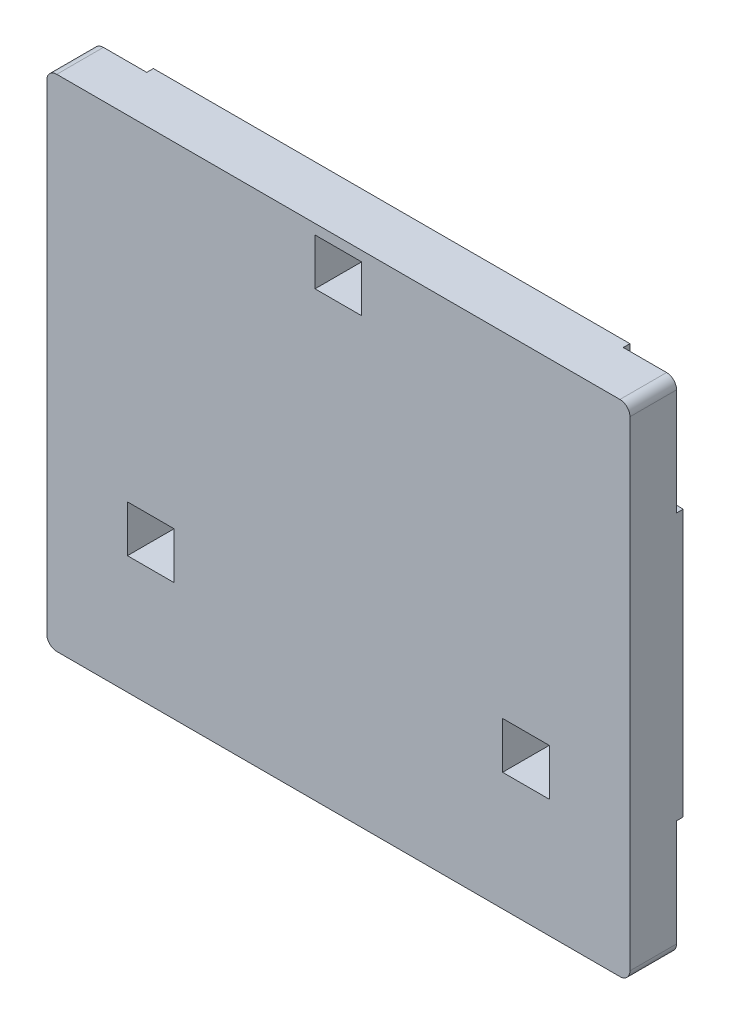
ISO-10303-21;
HEADER;
FILE_DESCRIPTION(('STEP AP214'),'2;1');
FILE_NAME('part.step','',(''),(''),'','','');
FILE_SCHEMA(('AUTOMOTIVE_DESIGN { 1 0 10303 214 1 1 1 1 }'));
ENDSEC;
DATA;
#1=APPLICATION_CONTEXT('core data for automotive mechanical design processes');
#2=APPLICATION_PROTOCOL_DEFINITION('international standard','automotive_design',2000,#1);
#3=PRODUCT_CONTEXT('',#1,'mechanical');
#4=PRODUCT('Part','Part','',(#3));
#5=PRODUCT_RELATED_PRODUCT_CATEGORY('part','',(#4));
#6=PRODUCT_DEFINITION_FORMATION('','',#4);
#7=PRODUCT_DEFINITION_CONTEXT('part definition',#1,'design');
#8=PRODUCT_DEFINITION('design','',#6,#7);
#9=PRODUCT_DEFINITION_SHAPE('','',#8);
#10=(LENGTH_UNIT() NAMED_UNIT(*) SI_UNIT(.MILLI.,.METRE.));
#11=(NAMED_UNIT(*) PLANE_ANGLE_UNIT() SI_UNIT($,.RADIAN.));
#12=(NAMED_UNIT(*) SI_UNIT($,.STERADIAN.) SOLID_ANGLE_UNIT());
#13=UNCERTAINTY_MEASURE_WITH_UNIT(LENGTH_MEASURE(1.E-05),#10,'distance_accuracy_value','');
#14=(GEOMETRIC_REPRESENTATION_CONTEXT(3) GLOBAL_UNCERTAINTY_ASSIGNED_CONTEXT((#13)) GLOBAL_UNIT_ASSIGNED_CONTEXT((#10,
#11,#12)) REPRESENTATION_CONTEXT('',''));
#15=CARTESIAN_POINT('',(0.,0.,0.));
#16=DIRECTION('',(0.,0.,1.));
#17=DIRECTION('',(1.,0.,0.));
#18=AXIS2_PLACEMENT_3D('',#15,#16,#17);
#19=CARTESIAN_POINT('',(0.,0.,16.));
#20=DIRECTION('',(-1.,0.,0.));
#21=DIRECTION('',(0.,-1.,0.));
#22=AXIS2_PLACEMENT_3D('',#19,#20,#21);
#23=PLANE('',#22);
#24=DIRECTION('',(0.,-1.,0.));
#25=VECTOR('',#24,1.);
#26=CARTESIAN_POINT('',(0.,0.,2.));
#27=LINE('',#26,#25);
#28=CARTESIAN_POINT('',(0.,-3.,2.));
#29=VERTEX_POINT('',#28);
#30=CARTESIAN_POINT('',(0.,-35.,2.));
#31=VERTEX_POINT('',#30);
#32=EDGE_CURVE('E299',#29,#31,#27,.T.);
#33=ORIENTED_EDGE('',*,*,#32,.F.);
#34=DIRECTION('',(0.,0.,-1.));
#35=VECTOR('',#34,1.);
#36=CARTESIAN_POINT('',(0.,-3.,16.));
#37=LINE('',#36,#35);
#38=CARTESIAN_POINT('',(0.,-3.,16.));
#39=VERTEX_POINT('',#38);
#40=EDGE_CURVE('E471',#29,#39,#37,.F.);
#41=ORIENTED_EDGE('',*,*,#40,.T.);
#42=DIRECTION('',(0.,1.,0.));
#43=VECTOR('',#42,1.);
#44=CARTESIAN_POINT('',(0.,0.,16.));
#45=LINE('',#44,#43);
#46=CARTESIAN_POINT('',(0.,-147.,16.));
#47=VERTEX_POINT('',#46);
#48=EDGE_CURVE('E440',#47,#39,#45,.T.);
#49=ORIENTED_EDGE('',*,*,#48,.F.);
#50=DIRECTION('',(0.,0.,-1.));
#51=VECTOR('',#50,1.);
#52=CARTESIAN_POINT('',(0.,-147.,16.));
#53=LINE('',#52,#51);
#54=CARTESIAN_POINT('',(0.,-147.,2.));
#55=VERTEX_POINT('',#54);
#56=EDGE_CURVE('E468',#47,#55,#53,.T.);
#57=ORIENTED_EDGE('',*,*,#56,.T.);
#58=DIRECTION('',(0.,-1.,0.));
#59=VECTOR('',#58,1.);
#60=CARTESIAN_POINT('',(0.,-150.,2.));
#61=LINE('',#60,#59);
#62=CARTESIAN_POINT('',(0.,-115.,2.));
#63=VERTEX_POINT('',#62);
#64=EDGE_CURVE('E274',#63,#55,#61,.T.);
#65=ORIENTED_EDGE('',*,*,#64,.F.);
#66=DIRECTION('',(0.,0.,-1.));
#67=VECTOR('',#66,1.);
#68=CARTESIAN_POINT('',(0.,-115.,2.));
#69=LINE('',#68,#67);
#70=CARTESIAN_POINT('',(0.,-115.,0.));
#71=VERTEX_POINT('',#70);
#72=EDGE_CURVE('E292',#63,#71,#69,.T.);
#73=ORIENTED_EDGE('',*,*,#72,.T.);
#74=DIRECTION('',(0.,1.,0.));
#75=VECTOR('',#74,1.);
#76=CARTESIAN_POINT('',(0.,0.,0.));
#77=LINE('',#76,#75);
#78=CARTESIAN_POINT('',(0.,-35.,0.));
#79=VERTEX_POINT('',#78);
#80=EDGE_CURVE('E371',#71,#79,#77,.T.);
#81=ORIENTED_EDGE('',*,*,#80,.T.);
#82=DIRECTION('',(0.,0.,-1.));
#83=VECTOR('',#82,1.);
#84=CARTESIAN_POINT('',(0.,-35.,2.));
#85=LINE('',#84,#83);
#86=EDGE_CURVE('E311',#31,#79,#85,.T.);
#87=ORIENTED_EDGE('',*,*,#86,.F.);
#88=EDGE_LOOP('',(#33,#41,#49,#57,#65,#73,#81,#87));
#89=FACE_BOUND('',#88,.T.);
#90=ADVANCED_FACE('F37',(#89),#23,.F.);
#91=CARTESIAN_POINT('',(0.,0.,16.));
#92=DIRECTION('',(0.,-1.,0.));
#93=DIRECTION('',(1.,0.,0.));
#94=AXIS2_PLACEMENT_3D('',#91,#92,#93);
#95=PLANE('',#94);
#96=DIRECTION('',(-1.,0.,0.));
#97=VECTOR('',#96,1.);
#98=CARTESIAN_POINT('',(0.,0.,16.));
#99=LINE('',#98,#97);
#100=CARTESIAN_POINT('',(-3.,0.,16.));
#101=VERTEX_POINT('',#100);
#102=CARTESIAN_POINT('',(-172.,0.,16.));
#103=VERTEX_POINT('',#102);
#104=EDGE_CURVE('E443',#101,#103,#99,.T.);
#105=ORIENTED_EDGE('',*,*,#104,.F.);
#106=DIRECTION('',(0.,0.,-1.));
#107=VECTOR('',#106,1.);
#108=CARTESIAN_POINT('',(-3.,0.,16.));
#109=LINE('',#108,#107);
#110=CARTESIAN_POINT('',(-3.,0.,2.));
#111=VERTEX_POINT('',#110);
#112=EDGE_CURVE('E463',#101,#111,#109,.T.);
#113=ORIENTED_EDGE('',*,*,#112,.T.);
#114=DIRECTION('',(1.,0.,0.));
#115=VECTOR('',#114,1.);
#116=CARTESIAN_POINT('',(0.,0.,2.));
#117=LINE('',#116,#115);
#118=CARTESIAN_POINT('',(-16.,0.,2.));
#119=VERTEX_POINT('',#118);
#120=EDGE_CURVE('E308',#119,#111,#117,.T.);
#121=ORIENTED_EDGE('',*,*,#120,.F.);
#122=DIRECTION('',(0.,0.,-1.));
#123=VECTOR('',#122,1.);
#124=CARTESIAN_POINT('',(-16.,0.,2.));
#125=LINE('',#124,#123);
#126=CARTESIAN_POINT('',(-16.,0.,0.));
#127=VERTEX_POINT('',#126);
#128=EDGE_CURVE('E290',#119,#127,#125,.T.);
#129=ORIENTED_EDGE('',*,*,#128,.T.);
#130=DIRECTION('',(-1.,0.,0.));
#131=VECTOR('',#130,1.);
#132=CARTESIAN_POINT('',(0.,0.,0.));
#133=LINE('',#132,#131);
#134=CARTESIAN_POINT('',(-159.,0.,0.));
#135=VERTEX_POINT('',#134);
#136=EDGE_CURVE('E456',#127,#135,#133,.T.);
#137=ORIENTED_EDGE('',*,*,#136,.T.);
#138=DIRECTION('',(0.,0.,-1.));
#139=VECTOR('',#138,1.);
#140=CARTESIAN_POINT('',(-159.,0.,2.));
#141=LINE('',#140,#139);
#142=CARTESIAN_POINT('',(-159.,0.,2.));
#143=VERTEX_POINT('',#142);
#144=EDGE_CURVE('E333',#143,#135,#141,.T.);
#145=ORIENTED_EDGE('',*,*,#144,.F.);
#146=DIRECTION('',(1.,0.,0.));
#147=VECTOR('',#146,1.);
#148=CARTESIAN_POINT('',(-175.,0.,2.));
#149=LINE('',#148,#147);
#150=CARTESIAN_POINT('',(-172.,0.,2.));
#151=VERTEX_POINT('',#150);
#152=EDGE_CURVE('E324',#151,#143,#149,.T.);
#153=ORIENTED_EDGE('',*,*,#152,.F.);
#154=DIRECTION('',(0.,0.,-1.));
#155=VECTOR('',#154,1.);
#156=CARTESIAN_POINT('',(-172.,0.,16.));
#157=LINE('',#156,#155);
#158=EDGE_CURVE('E453',#151,#103,#157,.F.);
#159=ORIENTED_EDGE('',*,*,#158,.T.);
#160=EDGE_LOOP('',(#105,#113,#121,#129,#137,#145,#153,#159));
#161=FACE_BOUND('',#160,.T.);
#162=ADVANCED_FACE('F538',(#161),#95,.F.);
#163=CARTESIAN_POINT('',(-175.,0.,16.));
#164=DIRECTION('',(1.,0.,0.));
#165=DIRECTION('',(0.,1.,0.));
#166=AXIS2_PLACEMENT_3D('',#163,#164,#165);
#167=PLANE('',#166);
#168=DIRECTION('',(0.,1.,0.));
#169=VECTOR('',#168,1.);
#170=CARTESIAN_POINT('',(-175.,-150.,2.));
#171=LINE('',#170,#169);
#172=CARTESIAN_POINT('',(-175.,-147.,2.));
#173=VERTEX_POINT('',#172);
#174=CARTESIAN_POINT('',(-175.,-115.,2.));
#175=VERTEX_POINT('',#174);
#176=EDGE_CURVE('E243',#173,#175,#171,.T.);
#177=ORIENTED_EDGE('',*,*,#176,.F.);
#178=DIRECTION('',(0.,0.,-1.));
#179=VECTOR('',#178,1.);
#180=CARTESIAN_POINT('',(-175.,-147.,16.));
#181=LINE('',#180,#179);
#182=CARTESIAN_POINT('',(-175.,-147.,16.));
#183=VERTEX_POINT('',#182);
#184=EDGE_CURVE('E45',#173,#183,#181,.F.);
#185=ORIENTED_EDGE('',*,*,#184,.T.);
#186=DIRECTION('',(0.,-1.,0.));
#187=VECTOR('',#186,1.);
#188=CARTESIAN_POINT('',(-175.,0.,16.));
#189=LINE('',#188,#187);
#190=CARTESIAN_POINT('',(-175.,-3.00000000000002,16.));
#191=VERTEX_POINT('',#190);
#192=EDGE_CURVE('E447',#191,#183,#189,.T.);
#193=ORIENTED_EDGE('',*,*,#192,.F.);
#194=DIRECTION('',(0.,0.,-1.));
#195=VECTOR('',#194,1.);
#196=CARTESIAN_POINT('',(-175.,-3.00000000000002,16.));
#197=LINE('',#196,#195);
#198=CARTESIAN_POINT('',(-175.,-3.00000000000002,2.));
#199=VERTEX_POINT('',#198);
#200=EDGE_CURVE('E489',#191,#199,#197,.T.);
#201=ORIENTED_EDGE('',*,*,#200,.T.);
#202=DIRECTION('',(0.,1.,0.));
#203=VECTOR('',#202,1.);
#204=CARTESIAN_POINT('',(-175.,0.,2.));
#205=LINE('',#204,#203);
#206=CARTESIAN_POINT('',(-175.,-34.9999999999999,2.));
#207=VERTEX_POINT('',#206);
#208=EDGE_CURVE('E321',#207,#199,#205,.T.);
#209=ORIENTED_EDGE('',*,*,#208,.F.);
#210=DIRECTION('',(0.,0.,-1.));
#211=VECTOR('',#210,1.);
#212=CARTESIAN_POINT('',(-175.,-34.9999999999999,2.));
#213=LINE('',#212,#211);
#214=CARTESIAN_POINT('',(-175.,-34.9999999999999,0.));
#215=VERTEX_POINT('',#214);
#216=EDGE_CURVE('E338',#207,#215,#213,.T.);
#217=ORIENTED_EDGE('',*,*,#216,.T.);
#218=DIRECTION('',(0.,-1.,0.));
#219=VECTOR('',#218,1.);
#220=CARTESIAN_POINT('',(-175.,0.,0.));
#221=LINE('',#220,#219);
#222=CARTESIAN_POINT('',(-175.,-115.,0.));
#223=VERTEX_POINT('',#222);
#224=EDGE_CURVE('E266',#215,#223,#221,.T.);
#225=ORIENTED_EDGE('',*,*,#224,.T.);
#226=DIRECTION('',(0.,0.,-1.));
#227=VECTOR('',#226,1.);
#228=CARTESIAN_POINT('',(-175.,-115.,2.));
#229=LINE('',#228,#227);
#230=EDGE_CURVE('E256',#175,#223,#229,.T.);
#231=ORIENTED_EDGE('',*,*,#230,.F.);
#232=EDGE_LOOP('',(#177,#185,#193,#201,#209,#217,#225,#231));
#233=FACE_BOUND('',#232,.T.);
#234=ADVANCED_FACE('F263',(#233),#167,.F.);
#235=CARTESIAN_POINT('',(0.,-150.,16.));
#236=DIRECTION('',(0.,1.,0.));
#237=DIRECTION('',(-1.,0.,0.));
#238=AXIS2_PLACEMENT_3D('',#235,#236,#237);
#239=PLANE('',#238);
#240=DIRECTION('',(-1.,0.,0.));
#241=VECTOR('',#240,1.);
#242=CARTESIAN_POINT('',(0.,-150.,2.));
#243=LINE('',#242,#241);
#244=CARTESIAN_POINT('',(-2.99999999999998,-150.,2.));
#245=VERTEX_POINT('',#244);
#246=CARTESIAN_POINT('',(-16.,-150.,2.));
#247=VERTEX_POINT('',#246);
#248=EDGE_CURVE('E277',#245,#247,#243,.T.);
#249=ORIENTED_EDGE('',*,*,#248,.F.);
#250=DIRECTION('',(0.,0.,-1.));
#251=VECTOR('',#250,1.);
#252=CARTESIAN_POINT('',(-2.99999999999998,-150.,16.));
#253=LINE('',#252,#251);
#254=CARTESIAN_POINT('',(-2.99999999999998,-150.,16.));
#255=VERTEX_POINT('',#254);
#256=EDGE_CURVE('E486',#245,#255,#253,.F.);
#257=ORIENTED_EDGE('',*,*,#256,.T.);
#258=DIRECTION('',(1.,0.,0.));
#259=VECTOR('',#258,1.);
#260=CARTESIAN_POINT('',(0.,-150.,16.));
#261=LINE('',#260,#259);
#262=CARTESIAN_POINT('',(-172.,-150.,16.));
#263=VERTEX_POINT('',#262);
#264=EDGE_CURVE('E450',#263,#255,#261,.T.);
#265=ORIENTED_EDGE('',*,*,#264,.F.);
#266=DIRECTION('',(0.,0.,-1.));
#267=VECTOR('',#266,1.);
#268=CARTESIAN_POINT('',(-172.,-150.,16.));
#269=LINE('',#268,#267);
#270=CARTESIAN_POINT('',(-172.,-150.,2.));
#271=VERTEX_POINT('',#270);
#272=EDGE_CURVE('E483',#263,#271,#269,.T.);
#273=ORIENTED_EDGE('',*,*,#272,.T.);
#274=DIRECTION('',(-1.,0.,0.));
#275=VECTOR('',#274,1.);
#276=CARTESIAN_POINT('',(-175.,-150.,2.));
#277=LINE('',#276,#275);
#278=CARTESIAN_POINT('',(-159.,-150.,2.));
#279=VERTEX_POINT('',#278);
#280=EDGE_CURVE('E267',#279,#271,#277,.T.);
#281=ORIENTED_EDGE('',*,*,#280,.F.);
#282=DIRECTION('',(0.,0.,-1.));
#283=VECTOR('',#282,1.);
#284=CARTESIAN_POINT('',(-159.,-150.,2.));
#285=LINE('',#284,#283);
#286=CARTESIAN_POINT('',(-159.,-150.,0.));
#287=VERTEX_POINT('',#286);
#288=EDGE_CURVE('E269',#279,#287,#285,.T.);
#289=ORIENTED_EDGE('',*,*,#288,.T.);
#290=DIRECTION('',(1.,0.,0.));
#291=VECTOR('',#290,1.);
#292=CARTESIAN_POINT('',(0.,-150.,0.));
#293=LINE('',#292,#291);
#294=CARTESIAN_POINT('',(-16.,-150.,0.));
#295=VERTEX_POINT('',#294);
#296=EDGE_CURVE('E444',#287,#295,#293,.T.);
#297=ORIENTED_EDGE('',*,*,#296,.T.);
#298=DIRECTION('',(0.,0.,-1.));
#299=VECTOR('',#298,1.);
#300=CARTESIAN_POINT('',(-16.,-150.,2.));
#301=LINE('',#300,#299);
#302=EDGE_CURVE('E286',#247,#295,#301,.T.);
#303=ORIENTED_EDGE('',*,*,#302,.F.);
#304=EDGE_LOOP('',(#249,#257,#265,#273,#281,#289,#297,#303));
#305=FACE_BOUND('',#304,.T.);
#306=ADVANCED_FACE('F502',(#305),#239,.F.);
#307=CARTESIAN_POINT('',(0.,0.,16.));
#308=DIRECTION('',(0.,0.,-1.));
#309=DIRECTION('',(-1.,0.,0.));
#310=AXIS2_PLACEMENT_3D('',#307,#308,#309);
#311=PLANE('',#310);
#312=DIRECTION('',(1.,0.,0.));
#313=VECTOR('',#312,1.);
#314=CARTESIAN_POINT('',(-80.5,-17.,16.));
#315=LINE('',#314,#313);
#316=CARTESIAN_POINT('',(-94.5,-17.,16.));
#317=VERTEX_POINT('',#316);
#318=CARTESIAN_POINT('',(-80.5,-17.,16.));
#319=VERTEX_POINT('',#318);
#320=EDGE_CURVE('E360',#317,#319,#315,.T.);
#321=ORIENTED_EDGE('',*,*,#320,.F.);
#322=DIRECTION('',(0.,-1.,0.));
#323=VECTOR('',#322,1.);
#324=CARTESIAN_POINT('',(-94.5,-3.00000000000004,16.));
#325=LINE('',#324,#323);
#326=CARTESIAN_POINT('',(-94.5,-3.00000000000004,16.));
#327=VERTEX_POINT('',#326);
#328=EDGE_CURVE('E358',#327,#317,#325,.T.);
#329=ORIENTED_EDGE('',*,*,#328,.F.);
#330=DIRECTION('',(-1.,0.,0.));
#331=VECTOR('',#330,1.);
#332=CARTESIAN_POINT('',(-80.5,-3.00000000000003,16.));
#333=LINE('',#332,#331);
#334=CARTESIAN_POINT('',(-80.5,-3.00000000000003,16.));
#335=VERTEX_POINT('',#334);
#336=EDGE_CURVE('E348',#335,#327,#333,.T.);
#337=ORIENTED_EDGE('',*,*,#336,.F.);
#338=DIRECTION('',(0.,1.,0.));
#339=VECTOR('',#338,1.);
#340=CARTESIAN_POINT('',(-80.5,-3.00000000000003,16.));
#341=LINE('',#340,#339);
#342=EDGE_CURVE('E364',#319,#335,#341,.T.);
#343=ORIENTED_EDGE('',*,*,#342,.F.);
#344=EDGE_LOOP('',(#321,#329,#337,#343));
#345=FACE_BOUND('',#344,.T.);
#346=DIRECTION('',(1.,0.,0.));
#347=VECTOR('',#346,1.);
#348=CARTESIAN_POINT('',(-136.791651245988,-114.5,16.));
#349=LINE('',#348,#347);
#350=CARTESIAN_POINT('',(-150.791651245988,-114.5,16.));
#351=VERTEX_POINT('',#350);
#352=CARTESIAN_POINT('',(-136.791651245988,-114.5,16.));
#353=VERTEX_POINT('',#352);
#354=EDGE_CURVE('E394',#351,#353,#349,.T.);
#355=ORIENTED_EDGE('',*,*,#354,.F.);
#356=DIRECTION('',(0.,-1.,0.));
#357=VECTOR('',#356,1.);
#358=CARTESIAN_POINT('',(-150.791651245988,-114.5,16.));
#359=LINE('',#358,#357);
#360=CARTESIAN_POINT('',(-150.791651245988,-100.5,16.));
#361=VERTEX_POINT('',#360);
#362=EDGE_CURVE('E392',#361,#351,#359,.T.);
#363=ORIENTED_EDGE('',*,*,#362,.F.);
#364=DIRECTION('',(-1.,0.,0.));
#365=VECTOR('',#364,1.);
#366=CARTESIAN_POINT('',(-136.791651245988,-100.5,16.));
#367=LINE('',#366,#365);
#368=CARTESIAN_POINT('',(-136.791651245988,-100.5,16.));
#369=VERTEX_POINT('',#368);
#370=EDGE_CURVE('E382',#369,#361,#367,.T.);
#371=ORIENTED_EDGE('',*,*,#370,.F.);
#372=DIRECTION('',(0.,1.,0.));
#373=VECTOR('',#372,1.);
#374=CARTESIAN_POINT('',(-136.791651245988,-114.5,16.));
#375=LINE('',#374,#373);
#376=EDGE_CURVE('E398',#353,#369,#375,.T.);
#377=ORIENTED_EDGE('',*,*,#376,.F.);
#378=EDGE_LOOP('',(#355,#363,#371,#377));
#379=FACE_BOUND('',#378,.T.);
#380=DIRECTION('',(1.,0.,0.));
#381=VECTOR('',#380,1.);
#382=CARTESIAN_POINT('',(-24.2083487540115,-114.5,16.));
#383=LINE('',#382,#381);
#384=CARTESIAN_POINT('',(-38.2083487540115,-114.5,16.));
#385=VERTEX_POINT('',#384);
#386=CARTESIAN_POINT('',(-24.2083487540115,-114.5,16.));
#387=VERTEX_POINT('',#386);
#388=EDGE_CURVE('E425',#385,#387,#383,.T.);
#389=ORIENTED_EDGE('',*,*,#388,.F.);
#390=DIRECTION('',(0.,-1.,0.));
#391=VECTOR('',#390,1.);
#392=CARTESIAN_POINT('',(-38.2083487540115,-114.5,16.));
#393=LINE('',#392,#391);
#394=CARTESIAN_POINT('',(-38.2083487540115,-100.5,16.));
#395=VERTEX_POINT('',#394);
#396=EDGE_CURVE('E340',#395,#385,#393,.T.);
#397=ORIENTED_EDGE('',*,*,#396,.F.);
#398=DIRECTION('',(-1.,0.,0.));
#399=VECTOR('',#398,1.);
#400=CARTESIAN_POINT('',(-24.2083487540115,-100.5,16.));
#401=LINE('',#400,#399);
#402=CARTESIAN_POINT('',(-24.2083487540115,-100.5,16.));
#403=VERTEX_POINT('',#402);
#404=EDGE_CURVE('E414',#403,#395,#401,.T.);
#405=ORIENTED_EDGE('',*,*,#404,.F.);
#406=DIRECTION('',(0.,1.,0.));
#407=VECTOR('',#406,1.);
#408=CARTESIAN_POINT('',(-24.2083487540115,-114.5,16.));
#409=LINE('',#408,#407);
#410=EDGE_CURVE('E428',#387,#403,#409,.T.);
#411=ORIENTED_EDGE('',*,*,#410,.F.);
#412=EDGE_LOOP('',(#389,#397,#405,#411));
#413=FACE_BOUND('',#412,.T.);
#414=ORIENTED_EDGE('',*,*,#48,.T.);
#415=CARTESIAN_POINT('',(-3.,-3.,16.));
#416=DIRECTION('',(0.,0.,-1.));
#417=DIRECTION('',(-1.,0.,0.));
#418=AXIS2_PLACEMENT_3D('',#415,#416,#417);
#419=CIRCLE('',#418,3.);
#420=EDGE_CURVE('E479',#39,#101,#419,.F.);
#421=ORIENTED_EDGE('',*,*,#420,.T.);
#422=ORIENTED_EDGE('',*,*,#104,.T.);
#423=CARTESIAN_POINT('',(-172.,-3.00000000000002,16.));
#424=DIRECTION('',(0.,0.,-1.));
#425=DIRECTION('',(-1.,0.,0.));
#426=AXIS2_PLACEMENT_3D('',#423,#424,#425);
#427=CIRCLE('',#426,3.);
#428=EDGE_CURVE('E473',#103,#191,#427,.F.);
#429=ORIENTED_EDGE('',*,*,#428,.T.);
#430=ORIENTED_EDGE('',*,*,#192,.T.);
#431=CARTESIAN_POINT('',(-172.,-147.,16.));
#432=DIRECTION('',(0.,0.,-1.));
#433=DIRECTION('',(-1.,0.,0.));
#434=AXIS2_PLACEMENT_3D('',#431,#432,#433);
#435=CIRCLE('',#434,3.);
#436=EDGE_CURVE('E475',#183,#263,#435,.F.);
#437=ORIENTED_EDGE('',*,*,#436,.T.);
#438=ORIENTED_EDGE('',*,*,#264,.T.);
#439=CARTESIAN_POINT('',(-2.99999999999998,-147.,16.));
#440=DIRECTION('',(0.,0.,-1.));
#441=DIRECTION('',(-1.,0.,0.));
#442=AXIS2_PLACEMENT_3D('',#439,#440,#441);
#443=CIRCLE('',#442,3.);
#444=EDGE_CURVE('E477',#255,#47,#443,.F.);
#445=ORIENTED_EDGE('',*,*,#444,.T.);
#446=EDGE_LOOP('',(#414,#421,#422,#429,#430,#437,#438,#445));
#447=FACE_BOUND('',#446,.T.);
#448=ADVANCED_FACE('F494',(#345,#379,#413,#447),#311,.F.);
#449=CARTESIAN_POINT('',(0.,0.,0.));
#450=DIRECTION('',(0.,0.,-1.));
#451=DIRECTION('',(-1.,0.,0.));
#452=AXIS2_PLACEMENT_3D('',#449,#450,#451);
#453=PLANE('',#452);
#454=DIRECTION('',(0.,1.,0.));
#455=VECTOR('',#454,1.);
#456=CARTESIAN_POINT('',(-16.,0.,0.));
#457=LINE('',#456,#455);
#458=CARTESIAN_POINT('',(-16.,-35.,0.));
#459=VERTEX_POINT('',#458);
#460=EDGE_CURVE('E302',#459,#127,#457,.T.);
#461=ORIENTED_EDGE('',*,*,#460,.F.);
#462=DIRECTION('',(-1.,0.,0.));
#463=VECTOR('',#462,1.);
#464=CARTESIAN_POINT('',(0.,-35.,0.));
#465=LINE('',#464,#463);
#466=EDGE_CURVE('E312',#79,#459,#465,.T.);
#467=ORIENTED_EDGE('',*,*,#466,.F.);
#468=ORIENTED_EDGE('',*,*,#80,.F.);
#469=DIRECTION('',(1.,0.,0.));
#470=VECTOR('',#469,1.);
#471=CARTESIAN_POINT('',(0.,-115.,0.));
#472=LINE('',#471,#470);
#473=CARTESIAN_POINT('',(-16.,-115.,0.));
#474=VERTEX_POINT('',#473);
#475=EDGE_CURVE('E278',#474,#71,#472,.T.);
#476=ORIENTED_EDGE('',*,*,#475,.F.);
#477=DIRECTION('',(0.,1.,0.));
#478=VECTOR('',#477,1.);
#479=CARTESIAN_POINT('',(-16.,-150.,0.));
#480=LINE('',#479,#478);
#481=EDGE_CURVE('E287',#295,#474,#480,.T.);
#482=ORIENTED_EDGE('',*,*,#481,.F.);
#483=ORIENTED_EDGE('',*,*,#296,.F.);
#484=DIRECTION('',(0.,-1.,0.));
#485=VECTOR('',#484,1.);
#486=CARTESIAN_POINT('',(-159.,-150.,0.));
#487=LINE('',#486,#485);
#488=CARTESIAN_POINT('',(-159.,-115.,0.));
#489=VERTEX_POINT('',#488);
#490=EDGE_CURVE('E251',#489,#287,#487,.T.);
#491=ORIENTED_EDGE('',*,*,#490,.F.);
#492=DIRECTION('',(1.,0.,0.));
#493=VECTOR('',#492,1.);
#494=CARTESIAN_POINT('',(-175.,-115.,0.));
#495=LINE('',#494,#493);
#496=EDGE_CURVE('E295',#223,#489,#495,.T.);
#497=ORIENTED_EDGE('',*,*,#496,.F.);
#498=ORIENTED_EDGE('',*,*,#224,.F.);
#499=DIRECTION('',(-1.,0.,0.));
#500=VECTOR('',#499,1.);
#501=CARTESIAN_POINT('',(-175.,-34.9999999999999,0.));
#502=LINE('',#501,#500);
#503=CARTESIAN_POINT('',(-159.,-34.9999999999999,0.));
#504=VERTEX_POINT('',#503);
#505=EDGE_CURVE('E325',#504,#215,#502,.T.);
#506=ORIENTED_EDGE('',*,*,#505,.F.);
#507=DIRECTION('',(0.,-1.,0.));
#508=VECTOR('',#507,1.);
#509=CARTESIAN_POINT('',(-159.,0.,0.));
#510=LINE('',#509,#508);
#511=EDGE_CURVE('E334',#135,#504,#510,.T.);
#512=ORIENTED_EDGE('',*,*,#511,.F.);
#513=ORIENTED_EDGE('',*,*,#136,.F.);
#514=EDGE_LOOP('',(#461,#467,#468,#476,#482,#483,#491,#497,#498,#506,#512,#513));
#515=FACE_BOUND('',#514,.T.);
#516=ADVANCED_FACE('F514',(#515),#453,.T.);
#517=CARTESIAN_POINT('',(-38.2083487540115,-114.5,2.));
#518=DIRECTION('',(-1.,0.,0.));
#519=DIRECTION('',(0.,0.,1.));
#520=AXIS2_PLACEMENT_3D('',#517,#518,#519);
#521=PLANE('',#520);
#522=ORIENTED_EDGE('',*,*,#396,.T.);
#523=DIRECTION('',(0.,0.,1.));
#524=VECTOR('',#523,1.);
#525=CARTESIAN_POINT('',(-38.2083487540115,-114.5,2.));
#526=LINE('',#525,#524);
#527=CARTESIAN_POINT('',(-38.2083487540115,-114.5,2.));
#528=VERTEX_POINT('',#527);
#529=EDGE_CURVE('E423',#528,#385,#526,.T.);
#530=ORIENTED_EDGE('',*,*,#529,.F.);
#531=DIRECTION('',(0.,-1.,0.));
#532=VECTOR('',#531,1.);
#533=CARTESIAN_POINT('',(-38.2083487540115,-114.5,2.));
#534=LINE('',#533,#532);
#535=CARTESIAN_POINT('',(-38.2083487540115,-100.5,2.));
#536=VERTEX_POINT('',#535);
#537=EDGE_CURVE('E410',#536,#528,#534,.T.);
#538=ORIENTED_EDGE('',*,*,#537,.F.);
#539=DIRECTION('',(0.,0.,1.));
#540=VECTOR('',#539,1.);
#541=CARTESIAN_POINT('',(-38.2083487540115,-100.5,2.));
#542=LINE('',#541,#540);
#543=EDGE_CURVE('E395',#536,#395,#542,.T.);
#544=ORIENTED_EDGE('',*,*,#543,.T.);
#545=EDGE_LOOP('',(#522,#530,#538,#544));
#546=FACE_BOUND('',#545,.T.);
#547=ADVANCED_FACE('F743',(#546),#521,.F.);
#548=CARTESIAN_POINT('',(-24.2083487540115,-100.5,2.));
#549=DIRECTION('',(0.,1.,0.));
#550=DIRECTION('',(0.,0.,1.));
#551=AXIS2_PLACEMENT_3D('',#548,#549,#550);
#552=PLANE('',#551);
#553=ORIENTED_EDGE('',*,*,#404,.T.);
#554=ORIENTED_EDGE('',*,*,#543,.F.);
#555=DIRECTION('',(-1.,0.,0.));
#556=VECTOR('',#555,1.);
#557=CARTESIAN_POINT('',(-24.2083487540115,-100.5,2.));
#558=LINE('',#557,#556);
#559=CARTESIAN_POINT('',(-24.2083487540115,-100.5,2.));
#560=VERTEX_POINT('',#559);
#561=EDGE_CURVE('E420',#560,#536,#558,.T.);
#562=ORIENTED_EDGE('',*,*,#561,.F.);
#563=DIRECTION('',(0.,0.,1.));
#564=VECTOR('',#563,1.);
#565=CARTESIAN_POINT('',(-24.2083487540115,-100.5,2.));
#566=LINE('',#565,#564);
#567=EDGE_CURVE('E434',#560,#403,#566,.T.);
#568=ORIENTED_EDGE('',*,*,#567,.T.);
#569=EDGE_LOOP('',(#553,#554,#562,#568));
#570=FACE_BOUND('',#569,.T.);
#571=ADVANCED_FACE('F872',(#570),#552,.F.);
#572=CARTESIAN_POINT('',(-24.2083487540115,-114.5,2.));
#573=DIRECTION('',(1.,0.,0.));
#574=DIRECTION('',(0.,0.,-1.));
#575=AXIS2_PLACEMENT_3D('',#572,#573,#574);
#576=PLANE('',#575);
#577=ORIENTED_EDGE('',*,*,#410,.T.);
#578=ORIENTED_EDGE('',*,*,#567,.F.);
#579=DIRECTION('',(0.,1.,0.));
#580=VECTOR('',#579,1.);
#581=CARTESIAN_POINT('',(-24.2083487540115,-114.5,2.));
#582=LINE('',#581,#580);
#583=CARTESIAN_POINT('',(-24.2083487540115,-114.5,2.));
#584=VERTEX_POINT('',#583);
#585=EDGE_CURVE('E417',#584,#560,#582,.T.);
#586=ORIENTED_EDGE('',*,*,#585,.F.);
#587=DIRECTION('',(0.,0.,1.));
#588=VECTOR('',#587,1.);
#589=CARTESIAN_POINT('',(-24.2083487540115,-114.5,2.));
#590=LINE('',#589,#588);
#591=EDGE_CURVE('E436',#584,#387,#590,.T.);
#592=ORIENTED_EDGE('',*,*,#591,.T.);
#593=EDGE_LOOP('',(#577,#578,#586,#592));
#594=FACE_BOUND('',#593,.T.);
#595=ADVANCED_FACE('F862',(#594),#576,.F.);
#596=CARTESIAN_POINT('',(-24.2083487540115,-114.5,2.));
#597=DIRECTION('',(0.,-1.,0.));
#598=DIRECTION('',(0.,0.,-1.));
#599=AXIS2_PLACEMENT_3D('',#596,#597,#598);
#600=PLANE('',#599);
#601=ORIENTED_EDGE('',*,*,#388,.T.);
#602=ORIENTED_EDGE('',*,*,#591,.F.);
#603=DIRECTION('',(1.,0.,0.));
#604=VECTOR('',#603,1.);
#605=CARTESIAN_POINT('',(-24.2083487540115,-114.5,2.));
#606=LINE('',#605,#604);
#607=EDGE_CURVE('E413',#528,#584,#606,.T.);
#608=ORIENTED_EDGE('',*,*,#607,.F.);
#609=ORIENTED_EDGE('',*,*,#529,.T.);
#610=EDGE_LOOP('',(#601,#602,#608,#609));
#611=FACE_BOUND('',#610,.T.);
#612=ADVANCED_FACE('F852',(#611),#600,.F.);
#613=CARTESIAN_POINT('',(0.,0.,2.));
#614=DIRECTION('',(0.,0.,1.));
#615=DIRECTION('',(1.,0.,0.));
#616=AXIS2_PLACEMENT_3D('',#613,#614,#615);
#617=PLANE('',#616);
#618=ORIENTED_EDGE('',*,*,#537,.T.);
#619=ORIENTED_EDGE('',*,*,#607,.T.);
#620=ORIENTED_EDGE('',*,*,#585,.T.);
#621=ORIENTED_EDGE('',*,*,#561,.T.);
#622=EDGE_LOOP('',(#618,#619,#620,#621));
#623=FACE_BOUND('',#622,.T.);
#624=ADVANCED_FACE('F842',(#623),#617,.T.);
#625=CARTESIAN_POINT('',(-150.791651245988,-114.5,2.));
#626=DIRECTION('',(-1.,0.,0.));
#627=DIRECTION('',(0.,0.,1.));
#628=AXIS2_PLACEMENT_3D('',#625,#626,#627);
#629=PLANE('',#628);
#630=ORIENTED_EDGE('',*,*,#362,.T.);
#631=DIRECTION('',(0.,0.,1.));
#632=VECTOR('',#631,1.);
#633=CARTESIAN_POINT('',(-150.791651245988,-114.5,2.));
#634=LINE('',#633,#632);
#635=CARTESIAN_POINT('',(-150.791651245988,-114.5,2.));
#636=VERTEX_POINT('',#635);
#637=EDGE_CURVE('E391',#636,#351,#634,.T.);
#638=ORIENTED_EDGE('',*,*,#637,.F.);
#639=DIRECTION('',(0.,-1.,0.));
#640=VECTOR('',#639,1.);
#641=CARTESIAN_POINT('',(-150.791651245988,-114.5,2.));
#642=LINE('',#641,#640);
#643=CARTESIAN_POINT('',(-150.791651245988,-100.5,2.));
#644=VERTEX_POINT('',#643);
#645=EDGE_CURVE('E378',#644,#636,#642,.T.);
#646=ORIENTED_EDGE('',*,*,#645,.F.);
#647=DIRECTION('',(0.,0.,1.));
#648=VECTOR('',#647,1.);
#649=CARTESIAN_POINT('',(-150.791651245988,-100.5,2.));
#650=LINE('',#649,#648);
#651=EDGE_CURVE('E361',#644,#361,#650,.T.);
#652=ORIENTED_EDGE('',*,*,#651,.T.);
#653=EDGE_LOOP('',(#630,#638,#646,#652));
#654=FACE_BOUND('',#653,.T.);
#655=ADVANCED_FACE('F832',(#654),#629,.F.);
#656=CARTESIAN_POINT('',(-136.791651245988,-100.5,2.));
#657=DIRECTION('',(0.,1.,0.));
#658=DIRECTION('',(0.,0.,1.));
#659=AXIS2_PLACEMENT_3D('',#656,#657,#658);
#660=PLANE('',#659);
#661=ORIENTED_EDGE('',*,*,#370,.T.);
#662=ORIENTED_EDGE('',*,*,#651,.F.);
#663=DIRECTION('',(-1.,0.,0.));
#664=VECTOR('',#663,1.);
#665=CARTESIAN_POINT('',(-136.791651245988,-100.5,2.));
#666=LINE('',#665,#664);
#667=CARTESIAN_POINT('',(-136.791651245988,-100.5,2.));
#668=VERTEX_POINT('',#667);
#669=EDGE_CURVE('E388',#668,#644,#666,.T.);
#670=ORIENTED_EDGE('',*,*,#669,.F.);
#671=DIRECTION('',(0.,0.,1.));
#672=VECTOR('',#671,1.);
#673=CARTESIAN_POINT('',(-136.791651245988,-100.5,2.));
#674=LINE('',#673,#672);
#675=EDGE_CURVE('E404',#668,#369,#674,.T.);
#676=ORIENTED_EDGE('',*,*,#675,.T.);
#677=EDGE_LOOP('',(#661,#662,#670,#676));
#678=FACE_BOUND('',#677,.T.);
#679=ADVANCED_FACE('F822',(#678),#660,.F.);
#680=CARTESIAN_POINT('',(-136.791651245988,-114.5,2.));
#681=DIRECTION('',(1.,0.,0.));
#682=DIRECTION('',(0.,0.,-1.));
#683=AXIS2_PLACEMENT_3D('',#680,#681,#682);
#684=PLANE('',#683);
#685=ORIENTED_EDGE('',*,*,#376,.T.);
#686=ORIENTED_EDGE('',*,*,#675,.F.);
#687=DIRECTION('',(0.,1.,0.));
#688=VECTOR('',#687,1.);
#689=CARTESIAN_POINT('',(-136.791651245988,-114.5,2.));
#690=LINE('',#689,#688);
#691=CARTESIAN_POINT('',(-136.791651245988,-114.5,2.));
#692=VERTEX_POINT('',#691);
#693=EDGE_CURVE('E385',#692,#668,#690,.T.);
#694=ORIENTED_EDGE('',*,*,#693,.F.);
#695=DIRECTION('',(0.,0.,1.));
#696=VECTOR('',#695,1.);
#697=CARTESIAN_POINT('',(-136.791651245988,-114.5,2.));
#698=LINE('',#697,#696);
#699=EDGE_CURVE('E406',#692,#353,#698,.T.);
#700=ORIENTED_EDGE('',*,*,#699,.T.);
#701=EDGE_LOOP('',(#685,#686,#694,#700));
#702=FACE_BOUND('',#701,.T.);
#703=ADVANCED_FACE('F812',(#702),#684,.F.);
#704=CARTESIAN_POINT('',(-136.791651245988,-114.5,2.));
#705=DIRECTION('',(0.,-1.,0.));
#706=DIRECTION('',(0.,0.,-1.));
#707=AXIS2_PLACEMENT_3D('',#704,#705,#706);
#708=PLANE('',#707);
#709=ORIENTED_EDGE('',*,*,#354,.T.);
#710=ORIENTED_EDGE('',*,*,#699,.F.);
#711=DIRECTION('',(1.,0.,0.));
#712=VECTOR('',#711,1.);
#713=CARTESIAN_POINT('',(-136.791651245988,-114.5,2.));
#714=LINE('',#713,#712);
#715=EDGE_CURVE('E381',#636,#692,#714,.T.);
#716=ORIENTED_EDGE('',*,*,#715,.F.);
#717=ORIENTED_EDGE('',*,*,#637,.T.);
#718=EDGE_LOOP('',(#709,#710,#716,#717));
#719=FACE_BOUND('',#718,.T.);
#720=ADVANCED_FACE('F802',(#719),#708,.F.);
#721=CARTESIAN_POINT('',(0.,0.,2.));
#722=DIRECTION('',(0.,0.,1.));
#723=DIRECTION('',(1.,0.,0.));
#724=AXIS2_PLACEMENT_3D('',#721,#722,#723);
#725=PLANE('',#724);
#726=ORIENTED_EDGE('',*,*,#645,.T.);
#727=ORIENTED_EDGE('',*,*,#715,.T.);
#728=ORIENTED_EDGE('',*,*,#693,.T.);
#729=ORIENTED_EDGE('',*,*,#669,.T.);
#730=EDGE_LOOP('',(#726,#727,#728,#729));
#731=FACE_BOUND('',#730,.T.);
#732=ADVANCED_FACE('F792',(#731),#725,.T.);
#733=CARTESIAN_POINT('',(-94.5,-3.00000000000004,2.));
#734=DIRECTION('',(-1.,0.,0.));
#735=DIRECTION('',(0.,0.,1.));
#736=AXIS2_PLACEMENT_3D('',#733,#734,#735);
#737=PLANE('',#736);
#738=ORIENTED_EDGE('',*,*,#328,.T.);
#739=DIRECTION('',(0.,0.,1.));
#740=VECTOR('',#739,1.);
#741=CARTESIAN_POINT('',(-94.5,-17.,2.));
#742=LINE('',#741,#740);
#743=CARTESIAN_POINT('',(-94.5,-17.,2.));
#744=VERTEX_POINT('',#743);
#745=EDGE_CURVE('E357',#744,#317,#742,.T.);
#746=ORIENTED_EDGE('',*,*,#745,.F.);
#747=DIRECTION('',(0.,-1.,0.));
#748=VECTOR('',#747,1.);
#749=CARTESIAN_POINT('',(-94.5,-3.00000000000004,2.));
#750=LINE('',#749,#748);
#751=CARTESIAN_POINT('',(-94.5,-3.00000000000004,2.));
#752=VERTEX_POINT('',#751);
#753=EDGE_CURVE('E344',#752,#744,#750,.T.);
#754=ORIENTED_EDGE('',*,*,#753,.F.);
#755=DIRECTION('',(0.,0.,1.));
#756=VECTOR('',#755,1.);
#757=CARTESIAN_POINT('',(-94.5,-3.00000000000004,2.));
#758=LINE('',#757,#756);
#759=EDGE_CURVE('E369',#752,#327,#758,.T.);
#760=ORIENTED_EDGE('',*,*,#759,.T.);
#761=EDGE_LOOP('',(#738,#746,#754,#760));
#762=FACE_BOUND('',#761,.T.);
#763=ADVANCED_FACE('F782',(#762),#737,.F.);
#764=CARTESIAN_POINT('',(-80.5,-3.00000000000003,2.));
#765=DIRECTION('',(0.,1.,0.));
#766=DIRECTION('',(-1.,0.,0.));
#767=AXIS2_PLACEMENT_3D('',#764,#765,#766);
#768=PLANE('',#767);
#769=ORIENTED_EDGE('',*,*,#336,.T.);
#770=ORIENTED_EDGE('',*,*,#759,.F.);
#771=DIRECTION('',(-1.,0.,0.));
#772=VECTOR('',#771,1.);
#773=CARTESIAN_POINT('',(-80.5,-3.00000000000003,2.));
#774=LINE('',#773,#772);
#775=CARTESIAN_POINT('',(-80.5,-3.00000000000003,2.));
#776=VERTEX_POINT('',#775);
#777=EDGE_CURVE('E354',#776,#752,#774,.T.);
#778=ORIENTED_EDGE('',*,*,#777,.F.);
#779=DIRECTION('',(0.,0.,1.));
#780=VECTOR('',#779,1.);
#781=CARTESIAN_POINT('',(-80.5,-3.00000000000003,2.));
#782=LINE('',#781,#780);
#783=EDGE_CURVE('E372',#776,#335,#782,.T.);
#784=ORIENTED_EDGE('',*,*,#783,.T.);
#785=EDGE_LOOP('',(#769,#770,#778,#784));
#786=FACE_BOUND('',#785,.T.);
#787=ADVANCED_FACE('F772',(#786),#768,.F.);
#788=CARTESIAN_POINT('',(-80.5,-3.00000000000003,2.));
#789=DIRECTION('',(1.,0.,0.));
#790=DIRECTION('',(0.,0.,-1.));
#791=AXIS2_PLACEMENT_3D('',#788,#789,#790);
#792=PLANE('',#791);
#793=ORIENTED_EDGE('',*,*,#342,.T.);
#794=ORIENTED_EDGE('',*,*,#783,.F.);
#795=DIRECTION('',(0.,1.,0.));
#796=VECTOR('',#795,1.);
#797=CARTESIAN_POINT('',(-80.5,-3.00000000000003,2.));
#798=LINE('',#797,#796);
#799=CARTESIAN_POINT('',(-80.5,-17.,2.));
#800=VERTEX_POINT('',#799);
#801=EDGE_CURVE('E351',#800,#776,#798,.T.);
#802=ORIENTED_EDGE('',*,*,#801,.F.);
#803=DIRECTION('',(0.,0.,1.));
#804=VECTOR('',#803,1.);
#805=CARTESIAN_POINT('',(-80.5,-17.,2.));
#806=LINE('',#805,#804);
#807=EDGE_CURVE('E374',#800,#319,#806,.T.);
#808=ORIENTED_EDGE('',*,*,#807,.T.);
#809=EDGE_LOOP('',(#793,#794,#802,#808));
#810=FACE_BOUND('',#809,.T.);
#811=ADVANCED_FACE('F762',(#810),#792,.F.);
#812=CARTESIAN_POINT('',(-80.5,-17.,2.));
#813=DIRECTION('',(0.,-1.,0.));
#814=DIRECTION('',(0.,0.,-1.));
#815=AXIS2_PLACEMENT_3D('',#812,#813,#814);
#816=PLANE('',#815);
#817=ORIENTED_EDGE('',*,*,#320,.T.);
#818=ORIENTED_EDGE('',*,*,#807,.F.);
#819=DIRECTION('',(1.,0.,0.));
#820=VECTOR('',#819,1.);
#821=CARTESIAN_POINT('',(-80.5,-17.,2.));
#822=LINE('',#821,#820);
#823=EDGE_CURVE('E347',#744,#800,#822,.T.);
#824=ORIENTED_EDGE('',*,*,#823,.F.);
#825=ORIENTED_EDGE('',*,*,#745,.T.);
#826=EDGE_LOOP('',(#817,#818,#824,#825));
#827=FACE_BOUND('',#826,.T.);
#828=ADVANCED_FACE('F752',(#827),#816,.F.);
#829=CARTESIAN_POINT('',(0.,0.,2.));
#830=DIRECTION('',(0.,0.,-1.));
#831=DIRECTION('',(-1.,0.,0.));
#832=AXIS2_PLACEMENT_3D('',#829,#830,#831);
#833=PLANE('',#832);
#834=ORIENTED_EDGE('',*,*,#753,.T.);
#835=ORIENTED_EDGE('',*,*,#823,.T.);
#836=ORIENTED_EDGE('',*,*,#801,.T.);
#837=ORIENTED_EDGE('',*,*,#777,.T.);
#838=EDGE_LOOP('',(#834,#835,#836,#837));
#839=FACE_BOUND('',#838,.T.);
#840=ADVANCED_FACE('F734',(#839),#833,.F.);
#841=CARTESIAN_POINT('',(-175.,-34.9999999999999,2.));
#842=DIRECTION('',(0.,-1.,0.));
#843=DIRECTION('',(0.,0.,-1.));
#844=AXIS2_PLACEMENT_3D('',#841,#842,#843);
#845=PLANE('',#844);
#846=ORIENTED_EDGE('',*,*,#505,.T.);
#847=ORIENTED_EDGE('',*,*,#216,.F.);
#848=DIRECTION('',(-1.,0.,0.));
#849=VECTOR('',#848,1.);
#850=CARTESIAN_POINT('',(-175.,-34.9999999999999,2.));
#851=LINE('',#850,#849);
#852=CARTESIAN_POINT('',(-159.,-34.9999999999999,2.));
#853=VERTEX_POINT('',#852);
#854=EDGE_CURVE('E330',#853,#207,#851,.T.);
#855=ORIENTED_EDGE('',*,*,#854,.F.);
#856=DIRECTION('',(0.,0.,-1.));
#857=VECTOR('',#856,1.);
#858=CARTESIAN_POINT('',(-159.,-34.9999999999999,2.));
#859=LINE('',#858,#857);
#860=EDGE_CURVE('E341',#853,#504,#859,.T.);
#861=ORIENTED_EDGE('',*,*,#860,.T.);
#862=EDGE_LOOP('',(#846,#847,#855,#861));
#863=FACE_BOUND('',#862,.T.);
#864=ADVANCED_FACE('F548',(#863),#845,.F.);
#865=CARTESIAN_POINT('',(-159.,0.,2.));
#866=DIRECTION('',(1.,0.,0.));
#867=DIRECTION('',(0.,0.,-1.));
#868=AXIS2_PLACEMENT_3D('',#865,#866,#867);
#869=PLANE('',#868);
#870=ORIENTED_EDGE('',*,*,#511,.T.);
#871=ORIENTED_EDGE('',*,*,#860,.F.);
#872=DIRECTION('',(0.,-1.,0.));
#873=VECTOR('',#872,1.);
#874=CARTESIAN_POINT('',(-159.,0.,2.));
#875=LINE('',#874,#873);
#876=EDGE_CURVE('E327',#143,#853,#875,.T.);
#877=ORIENTED_EDGE('',*,*,#876,.F.);
#878=ORIENTED_EDGE('',*,*,#144,.T.);
#879=EDGE_LOOP('',(#870,#871,#877,#878));
#880=FACE_BOUND('',#879,.T.);
#881=ADVANCED_FACE('F647',(#880),#869,.F.);
#882=CARTESIAN_POINT('',(0.,0.,2.));
#883=DIRECTION('',(0.,0.,1.));
#884=DIRECTION('',(1.,0.,0.));
#885=AXIS2_PLACEMENT_3D('',#882,#883,#884);
#886=PLANE('',#885);
#887=ORIENTED_EDGE('',*,*,#208,.T.);
#888=CARTESIAN_POINT('',(-172.,-3.00000000000002,2.));
#889=DIRECTION('',(0.,0.,1.));
#890=DIRECTION('',(1.,0.,0.));
#891=AXIS2_PLACEMENT_3D('',#888,#889,#890);
#892=CIRCLE('',#891,3.);
#893=EDGE_CURVE('E11',#199,#151,#892,.F.);
#894=ORIENTED_EDGE('',*,*,#893,.T.);
#895=ORIENTED_EDGE('',*,*,#152,.T.);
#896=ORIENTED_EDGE('',*,*,#876,.T.);
#897=ORIENTED_EDGE('',*,*,#854,.T.);
#898=EDGE_LOOP('',(#887,#894,#895,#896,#897));
#899=FACE_BOUND('',#898,.T.);
#900=ADVANCED_FACE('F544',(#899),#886,.F.);
#901=CARTESIAN_POINT('',(-159.,-150.,2.));
#902=DIRECTION('',(1.,0.,0.));
#903=DIRECTION('',(0.,0.,-1.));
#904=AXIS2_PLACEMENT_3D('',#901,#902,#903);
#905=PLANE('',#904);
#906=ORIENTED_EDGE('',*,*,#490,.T.);
#907=ORIENTED_EDGE('',*,*,#288,.F.);
#908=DIRECTION('',(0.,-1.,0.));
#909=VECTOR('',#908,1.);
#910=CARTESIAN_POINT('',(-159.,-150.,2.));
#911=LINE('',#910,#909);
#912=CARTESIAN_POINT('',(-159.,-115.,2.));
#913=VERTEX_POINT('',#912);
#914=EDGE_CURVE('E260',#913,#279,#911,.T.);
#915=ORIENTED_EDGE('',*,*,#914,.F.);
#916=DIRECTION('',(0.,0.,-1.));
#917=VECTOR('',#916,1.);
#918=CARTESIAN_POINT('',(-159.,-115.,2.));
#919=LINE('',#918,#917);
#920=EDGE_CURVE('E258',#913,#489,#919,.T.);
#921=ORIENTED_EDGE('',*,*,#920,.T.);
#922=EDGE_LOOP('',(#906,#907,#915,#921));
#923=FACE_BOUND('',#922,.T.);
#924=ADVANCED_FACE('F646',(#923),#905,.F.);
#925=CARTESIAN_POINT('',(-175.,-115.,2.));
#926=DIRECTION('',(0.,1.,0.));
#927=DIRECTION('',(-1.,0.,0.));
#928=AXIS2_PLACEMENT_3D('',#925,#926,#927);
#929=PLANE('',#928);
#930=ORIENTED_EDGE('',*,*,#496,.T.);
#931=ORIENTED_EDGE('',*,*,#920,.F.);
#932=DIRECTION('',(1.,0.,0.));
#933=VECTOR('',#932,1.);
#934=CARTESIAN_POINT('',(-175.,-115.,2.));
#935=LINE('',#934,#933);
#936=EDGE_CURVE('E247',#175,#913,#935,.T.);
#937=ORIENTED_EDGE('',*,*,#936,.F.);
#938=ORIENTED_EDGE('',*,*,#230,.T.);
#939=EDGE_LOOP('',(#930,#931,#937,#938));
#940=FACE_BOUND('',#939,.T.);
#941=ADVANCED_FACE('F255',(#940),#929,.F.);
#942=CARTESIAN_POINT('',(0.,0.,2.));
#943=DIRECTION('',(0.,0.,-1.));
#944=DIRECTION('',(-1.,0.,0.));
#945=AXIS2_PLACEMENT_3D('',#942,#943,#944);
#946=PLANE('',#945);
#947=ORIENTED_EDGE('',*,*,#280,.T.);
#948=CARTESIAN_POINT('',(-172.,-147.,2.));
#949=DIRECTION('',(0.,0.,-1.));
#950=DIRECTION('',(-1.,0.,0.));
#951=AXIS2_PLACEMENT_3D('',#948,#949,#950);
#952=CIRCLE('',#951,3.);
#953=EDGE_CURVE('E58',#271,#173,#952,.T.);
#954=ORIENTED_EDGE('',*,*,#953,.T.);
#955=ORIENTED_EDGE('',*,*,#176,.T.);
#956=ORIENTED_EDGE('',*,*,#936,.T.);
#957=ORIENTED_EDGE('',*,*,#914,.T.);
#958=EDGE_LOOP('',(#947,#954,#955,#956,#957));
#959=FACE_BOUND('',#958,.T.);
#960=ADVANCED_FACE('F245',(#959),#946,.T.);
#961=CARTESIAN_POINT('',(0.,-115.,2.));
#962=DIRECTION('',(0.,1.,0.));
#963=DIRECTION('',(0.,0.,1.));
#964=AXIS2_PLACEMENT_3D('',#961,#962,#963);
#965=PLANE('',#964);
#966=ORIENTED_EDGE('',*,*,#475,.T.);
#967=ORIENTED_EDGE('',*,*,#72,.F.);
#968=DIRECTION('',(1.,0.,0.));
#969=VECTOR('',#968,1.);
#970=CARTESIAN_POINT('',(0.,-115.,2.));
#971=LINE('',#970,#969);
#972=CARTESIAN_POINT('',(-16.,-115.,2.));
#973=VERTEX_POINT('',#972);
#974=EDGE_CURVE('E283',#973,#63,#971,.T.);
#975=ORIENTED_EDGE('',*,*,#974,.F.);
#976=DIRECTION('',(0.,0.,-1.));
#977=VECTOR('',#976,1.);
#978=CARTESIAN_POINT('',(-16.,-115.,2.));
#979=LINE('',#978,#977);
#980=EDGE_CURVE('E296',#973,#474,#979,.T.);
#981=ORIENTED_EDGE('',*,*,#980,.T.);
#982=EDGE_LOOP('',(#966,#967,#975,#981));
#983=FACE_BOUND('',#982,.T.);
#984=ADVANCED_FACE('F564',(#983),#965,.F.);
#985=CARTESIAN_POINT('',(-16.,-150.,2.));
#986=DIRECTION('',(-1.,0.,0.));
#987=DIRECTION('',(0.,-1.,0.));
#988=AXIS2_PLACEMENT_3D('',#985,#986,#987);
#989=PLANE('',#988);
#990=ORIENTED_EDGE('',*,*,#481,.T.);
#991=ORIENTED_EDGE('',*,*,#980,.F.);
#992=DIRECTION('',(0.,1.,0.));
#993=VECTOR('',#992,1.);
#994=CARTESIAN_POINT('',(-16.,-150.,2.));
#995=LINE('',#994,#993);
#996=EDGE_CURVE('E280',#247,#973,#995,.T.);
#997=ORIENTED_EDGE('',*,*,#996,.F.);
#998=ORIENTED_EDGE('',*,*,#302,.T.);
#999=EDGE_LOOP('',(#990,#991,#997,#998));
#1000=FACE_BOUND('',#999,.T.);
#1001=ADVANCED_FACE('F518',(#1000),#989,.F.);
#1002=CARTESIAN_POINT('',(0.,0.,2.));
#1003=DIRECTION('',(0.,0.,1.));
#1004=DIRECTION('',(1.,0.,0.));
#1005=AXIS2_PLACEMENT_3D('',#1002,#1003,#1004);
#1006=PLANE('',#1005);
#1007=ORIENTED_EDGE('',*,*,#64,.T.);
#1008=CARTESIAN_POINT('',(-2.99999999999998,-147.,2.));
#1009=DIRECTION('',(0.,0.,1.));
#1010=DIRECTION('',(1.,0.,0.));
#1011=AXIS2_PLACEMENT_3D('',#1008,#1009,#1010);
#1012=CIRCLE('',#1011,3.);
#1013=EDGE_CURVE('E481',#55,#245,#1012,.F.);
#1014=ORIENTED_EDGE('',*,*,#1013,.T.);
#1015=ORIENTED_EDGE('',*,*,#248,.T.);
#1016=ORIENTED_EDGE('',*,*,#996,.T.);
#1017=ORIENTED_EDGE('',*,*,#974,.T.);
#1018=EDGE_LOOP('',(#1007,#1014,#1015,#1016,#1017));
#1019=FACE_BOUND('',#1018,.T.);
#1020=ADVANCED_FACE('F565',(#1019),#1006,.F.);
#1021=CARTESIAN_POINT('',(-16.,0.,2.));
#1022=DIRECTION('',(-1.,0.,0.));
#1023=DIRECTION('',(0.,-1.,0.));
#1024=AXIS2_PLACEMENT_3D('',#1021,#1022,#1023);
#1025=PLANE('',#1024);
#1026=ORIENTED_EDGE('',*,*,#460,.T.);
#1027=ORIENTED_EDGE('',*,*,#128,.F.);
#1028=DIRECTION('',(0.,1.,0.));
#1029=VECTOR('',#1028,1.);
#1030=CARTESIAN_POINT('',(-16.,0.,2.));
#1031=LINE('',#1030,#1029);
#1032=CARTESIAN_POINT('',(-16.,-35.,2.));
#1033=VERTEX_POINT('',#1032);
#1034=EDGE_CURVE('E305',#1033,#119,#1031,.T.);
#1035=ORIENTED_EDGE('',*,*,#1034,.F.);
#1036=DIRECTION('',(0.,0.,-1.));
#1037=VECTOR('',#1036,1.);
#1038=CARTESIAN_POINT('',(-16.,-35.,2.));
#1039=LINE('',#1038,#1037);
#1040=EDGE_CURVE('E318',#1033,#459,#1039,.T.);
#1041=ORIENTED_EDGE('',*,*,#1040,.T.);
#1042=EDGE_LOOP('',(#1026,#1027,#1035,#1041));
#1043=FACE_BOUND('',#1042,.T.);
#1044=ADVANCED_FACE('F555',(#1043),#1025,.F.);
#1045=CARTESIAN_POINT('',(0.,-35.,2.));
#1046=DIRECTION('',(0.,-1.,0.));
#1047=DIRECTION('',(0.,0.,-1.));
#1048=AXIS2_PLACEMENT_3D('',#1045,#1046,#1047);
#1049=PLANE('',#1048);
#1050=ORIENTED_EDGE('',*,*,#466,.T.);
#1051=ORIENTED_EDGE('',*,*,#1040,.F.);
#1052=DIRECTION('',(-1.,0.,0.));
#1053=VECTOR('',#1052,1.);
#1054=CARTESIAN_POINT('',(0.,-35.,2.));
#1055=LINE('',#1054,#1053);
#1056=EDGE_CURVE('E301',#31,#1033,#1055,.T.);
#1057=ORIENTED_EDGE('',*,*,#1056,.F.);
#1058=ORIENTED_EDGE('',*,*,#86,.T.);
#1059=EDGE_LOOP('',(#1050,#1051,#1057,#1058));
#1060=FACE_BOUND('',#1059,.T.);
#1061=ADVANCED_FACE('F560',(#1060),#1049,.F.);
#1062=CARTESIAN_POINT('',(0.,0.,2.));
#1063=DIRECTION('',(0.,0.,-1.));
#1064=DIRECTION('',(-1.,0.,0.));
#1065=AXIS2_PLACEMENT_3D('',#1062,#1063,#1064);
#1066=PLANE('',#1065);
#1067=ORIENTED_EDGE('',*,*,#120,.T.);
#1068=CARTESIAN_POINT('',(-3.,-3.,2.));
#1069=DIRECTION('',(0.,0.,-1.));
#1070=DIRECTION('',(-1.,0.,0.));
#1071=AXIS2_PLACEMENT_3D('',#1068,#1069,#1070);
#1072=CIRCLE('',#1071,3.);
#1073=EDGE_CURVE('E466',#111,#29,#1072,.T.);
#1074=ORIENTED_EDGE('',*,*,#1073,.T.);
#1075=ORIENTED_EDGE('',*,*,#32,.T.);
#1076=ORIENTED_EDGE('',*,*,#1056,.T.);
#1077=ORIENTED_EDGE('',*,*,#1034,.T.);
#1078=EDGE_LOOP('',(#1067,#1074,#1075,#1076,#1077));
#1079=FACE_BOUND('',#1078,.T.);
#1080=ADVANCED_FACE('F557',(#1079),#1066,.T.);
#1081=CARTESIAN_POINT('',(-3.,-3.,16.));
#1082=DIRECTION('',(0.,0.,-1.));
#1083=DIRECTION('',(-1.,0.,0.));
#1084=AXIS2_PLACEMENT_3D('',#1081,#1082,#1083);
#1085=CYLINDRICAL_SURFACE('',#1084,3.);
#1086=ORIENTED_EDGE('',*,*,#420,.F.);
#1087=ORIENTED_EDGE('',*,*,#40,.F.);
#1088=ORIENTED_EDGE('',*,*,#1073,.F.);
#1089=ORIENTED_EDGE('',*,*,#112,.F.);
#1090=EDGE_LOOP('',(#1086,#1087,#1088,#1089));
#1091=FACE_BOUND('',#1090,.T.);
#1092=ADVANCED_FACE('F534',(#1091),#1085,.T.);
#1093=CARTESIAN_POINT('',(-2.99999999999998,-147.,16.));
#1094=DIRECTION('',(0.,0.,-1.));
#1095=DIRECTION('',(-1.,0.,0.));
#1096=AXIS2_PLACEMENT_3D('',#1093,#1094,#1095);
#1097=CYLINDRICAL_SURFACE('',#1096,3.);
#1098=ORIENTED_EDGE('',*,*,#444,.F.);
#1099=ORIENTED_EDGE('',*,*,#256,.F.);
#1100=ORIENTED_EDGE('',*,*,#1013,.F.);
#1101=ORIENTED_EDGE('',*,*,#56,.F.);
#1102=EDGE_LOOP('',(#1098,#1099,#1100,#1101));
#1103=FACE_BOUND('',#1102,.T.);
#1104=ADVANCED_FACE('F524',(#1103),#1097,.T.);
#1105=CARTESIAN_POINT('',(-172.,-147.,16.));
#1106=DIRECTION('',(0.,0.,-1.));
#1107=DIRECTION('',(-1.,0.,0.));
#1108=AXIS2_PLACEMENT_3D('',#1105,#1106,#1107);
#1109=CYLINDRICAL_SURFACE('',#1108,3.);
#1110=ORIENTED_EDGE('',*,*,#436,.F.);
#1111=ORIENTED_EDGE('',*,*,#184,.F.);
#1112=ORIENTED_EDGE('',*,*,#953,.F.);
#1113=ORIENTED_EDGE('',*,*,#272,.F.);
#1114=EDGE_LOOP('',(#1110,#1111,#1112,#1113));
#1115=FACE_BOUND('',#1114,.T.);
#1116=ADVANCED_FACE('F498',(#1115),#1109,.T.);
#1117=CARTESIAN_POINT('',(-172.,-3.00000000000002,16.));
#1118=DIRECTION('',(0.,0.,-1.));
#1119=DIRECTION('',(-1.,0.,0.));
#1120=AXIS2_PLACEMENT_3D('',#1117,#1118,#1119);
#1121=CYLINDRICAL_SURFACE('',#1120,3.);
#1122=ORIENTED_EDGE('',*,*,#428,.F.);
#1123=ORIENTED_EDGE('',*,*,#158,.F.);
#1124=ORIENTED_EDGE('',*,*,#893,.F.);
#1125=ORIENTED_EDGE('',*,*,#200,.F.);
#1126=EDGE_LOOP('',(#1122,#1123,#1124,#1125));
#1127=FACE_BOUND('',#1126,.T.);
#1128=ADVANCED_FACE('F39',(#1127),#1121,.T.);
#1129=CLOSED_SHELL('',(#90,#162,#234,#306,#448,#516,#547,#571,#595,#612,#624,#655,#679,#703,
#720,#732,#763,#787,#811,#828,#840,#864,#881,#900,#924,#941,#960,#984,#1001,#1020,#1044,#1061,
#1080,#1092,#1104,#1116,#1128));
#1130=MANIFOLD_SOLID_BREP('B2',#1129);
#1131=ADVANCED_BREP_SHAPE_REPRESENTATION('',(#18,#1130),#14);
#1132=SHAPE_DEFINITION_REPRESENTATION(#9,#1131);
ENDSEC;
END-ISO-10303-21;
